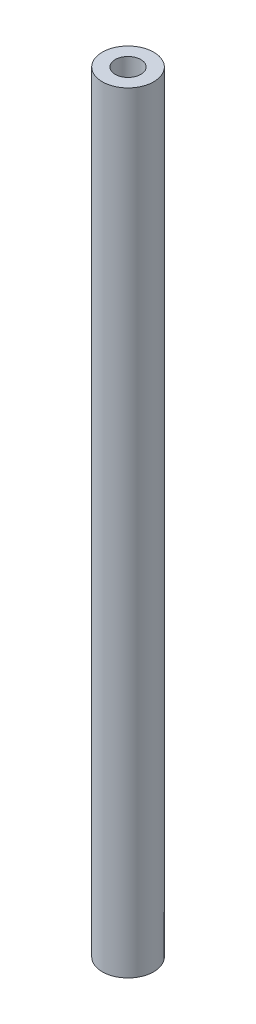
ISO-10303-21;
HEADER;
FILE_DESCRIPTION(('STEP AP214'),'2;1');
FILE_NAME('part.step','',(''),(''),'','','');
FILE_SCHEMA(('AUTOMOTIVE_DESIGN { 1 0 10303 214 1 1 1 1 }'));
ENDSEC;
DATA;
#1=APPLICATION_CONTEXT('core data for automotive mechanical design processes');
#2=APPLICATION_PROTOCOL_DEFINITION('international standard','automotive_design',2000,#1);
#3=PRODUCT_CONTEXT('',#1,'mechanical');
#4=PRODUCT('Part','Part','',(#3));
#5=PRODUCT_RELATED_PRODUCT_CATEGORY('part','',(#4));
#6=PRODUCT_DEFINITION_FORMATION('','',#4);
#7=PRODUCT_DEFINITION_CONTEXT('part definition',#1,'design');
#8=PRODUCT_DEFINITION('design','',#6,#7);
#9=PRODUCT_DEFINITION_SHAPE('','',#8);
#10=(LENGTH_UNIT() NAMED_UNIT(*) SI_UNIT(.MILLI.,.METRE.));
#11=(NAMED_UNIT(*) PLANE_ANGLE_UNIT() SI_UNIT($,.RADIAN.));
#12=(NAMED_UNIT(*) SI_UNIT($,.STERADIAN.) SOLID_ANGLE_UNIT());
#13=UNCERTAINTY_MEASURE_WITH_UNIT(LENGTH_MEASURE(1.E-05),#10,'distance_accuracy_value','');
#14=(GEOMETRIC_REPRESENTATION_CONTEXT(3) GLOBAL_UNCERTAINTY_ASSIGNED_CONTEXT((#13)) GLOBAL_UNIT_ASSIGNED_CONTEXT((#10,
#11,#12)) REPRESENTATION_CONTEXT('',''));
#15=CARTESIAN_POINT('',(0.,0.,0.));
#16=DIRECTION('',(0.,0.,1.));
#17=DIRECTION('',(1.,0.,0.));
#18=AXIS2_PLACEMENT_3D('',#15,#16,#17);
#19=CARTESIAN_POINT('',(0.,90.,0.));
#20=DIRECTION('',(0.,1.,0.));
#21=DIRECTION('',(0.,0.,1.));
#22=AXIS2_PLACEMENT_3D('',#19,#20,#21);
#23=PLANE('',#22);
#24=CARTESIAN_POINT('',(0.,90.,0.));
#25=DIRECTION('',(0.,1.,0.));
#26=DIRECTION('',(0.,0.,1.));
#27=AXIS2_PLACEMENT_3D('',#24,#25,#26);
#28=CIRCLE('',#27,3.);
#29=CARTESIAN_POINT('',(0.,90.,-3.));
#30=VERTEX_POINT('',#29);
#31=EDGE_CURVE('E10',#30,#30,#28,.T.);
#32=ORIENTED_EDGE('',*,*,#31,.T.);
#33=EDGE_LOOP('',(#32));
#34=FACE_BOUND('',#33,.T.);
#35=CARTESIAN_POINT('',(0.,90.,0.));
#36=DIRECTION('',(0.,1.,0.));
#37=DIRECTION('',(0.,0.,1.));
#38=AXIS2_PLACEMENT_3D('',#35,#36,#37);
#39=CIRCLE('',#38,1.5);
#40=CARTESIAN_POINT('',(0.,90.,-1.5));
#41=VERTEX_POINT('',#40);
#42=EDGE_CURVE('E50',#41,#41,#39,.T.);
#43=ORIENTED_EDGE('',*,*,#42,.F.);
#44=EDGE_LOOP('',(#43));
#45=FACE_BOUND('',#44,.T.);
#46=ADVANCED_FACE('F37',(#34,#45),#23,.T.);
#47=CARTESIAN_POINT('',(0.,0.,0.));
#48=DIRECTION('',(0.,1.,0.));
#49=DIRECTION('',(0.,0.,1.));
#50=AXIS2_PLACEMENT_3D('',#47,#48,#49);
#51=PLANE('',#50);
#52=CARTESIAN_POINT('',(0.,0.,0.));
#53=DIRECTION('',(0.,1.,0.));
#54=DIRECTION('',(0.,0.,1.));
#55=AXIS2_PLACEMENT_3D('',#52,#53,#54);
#56=CIRCLE('',#55,3.);
#57=CARTESIAN_POINT('',(0.,0.,-3.));
#58=VERTEX_POINT('',#57);
#59=EDGE_CURVE('E41',#58,#58,#56,.T.);
#60=ORIENTED_EDGE('',*,*,#59,.F.);
#61=EDGE_LOOP('',(#60));
#62=FACE_BOUND('',#61,.T.);
#63=CARTESIAN_POINT('',(0.,0.,0.));
#64=DIRECTION('',(0.,1.,0.));
#65=DIRECTION('',(0.,0.,1.));
#66=AXIS2_PLACEMENT_3D('',#63,#64,#65);
#67=CIRCLE('',#66,1.5);
#68=CARTESIAN_POINT('',(0.,0.,-1.5));
#69=VERTEX_POINT('',#68);
#70=EDGE_CURVE('E52',#69,#69,#67,.T.);
#71=ORIENTED_EDGE('',*,*,#70,.T.);
#72=EDGE_LOOP('',(#71));
#73=FACE_BOUND('',#72,.T.);
#74=ADVANCED_FACE('F64',(#62,#73),#51,.F.);
#75=CARTESIAN_POINT('',(0.,90.,0.));
#76=DIRECTION('',(0.,-1.,0.));
#77=DIRECTION('',(0.,0.,-1.));
#78=AXIS2_PLACEMENT_3D('',#75,#76,#77);
#79=CYLINDRICAL_SURFACE('',#78,3.);
#80=CARTESIAN_POINT('',(0.,90.,-3.));
#81=CARTESIAN_POINT('',(0.,89.0625,-3.));
#82=CARTESIAN_POINT('',(0.,88.125,-3.));
#83=CARTESIAN_POINT('',(0.,86.25,-3.));
#84=CARTESIAN_POINT('',(0.,85.3125,-3.));
#85=CARTESIAN_POINT('',(0.,83.4375,-3.));
#86=CARTESIAN_POINT('',(0.,82.5,-3.));
#87=CARTESIAN_POINT('',(0.,80.625,-3.));
#88=CARTESIAN_POINT('',(0.,79.6875,-3.));
#89=CARTESIAN_POINT('',(0.,77.8125,-3.));
#90=CARTESIAN_POINT('',(0.,76.875,-3.));
#91=CARTESIAN_POINT('',(0.,75.,-3.));
#92=CARTESIAN_POINT('',(0.,74.0625,-3.));
#93=CARTESIAN_POINT('',(0.,72.1875,-3.));
#94=CARTESIAN_POINT('',(0.,71.25,-3.));
#95=CARTESIAN_POINT('',(0.,69.375,-3.));
#96=CARTESIAN_POINT('',(0.,68.4375,-3.));
#97=CARTESIAN_POINT('',(0.,66.5625,-3.));
#98=CARTESIAN_POINT('',(0.,65.625,-3.));
#99=CARTESIAN_POINT('',(0.,63.75,-3.));
#100=CARTESIAN_POINT('',(0.,62.8125,-3.));
#101=CARTESIAN_POINT('',(0.,60.9375,-3.));
#102=CARTESIAN_POINT('',(0.,60.,-3.));
#103=CARTESIAN_POINT('',(0.,58.125,-3.));
#104=CARTESIAN_POINT('',(0.,57.1875,-3.));
#105=CARTESIAN_POINT('',(0.,55.3125,-3.));
#106=CARTESIAN_POINT('',(0.,54.375,-3.));
#107=CARTESIAN_POINT('',(0.,52.5,-3.));
#108=CARTESIAN_POINT('',(0.,51.5625,-3.));
#109=CARTESIAN_POINT('',(0.,49.6875,-3.));
#110=CARTESIAN_POINT('',(0.,48.75,-3.));
#111=CARTESIAN_POINT('',(0.,46.875,-3.));
#112=CARTESIAN_POINT('',(0.,45.9375,-3.));
#113=CARTESIAN_POINT('',(0.,44.0625,-3.));
#114=CARTESIAN_POINT('',(0.,43.125,-3.));
#115=CARTESIAN_POINT('',(0.,41.25,-3.));
#116=CARTESIAN_POINT('',(0.,40.3125,-3.));
#117=CARTESIAN_POINT('',(0.,38.4375,-3.));
#118=CARTESIAN_POINT('',(0.,37.5,-3.));
#119=CARTESIAN_POINT('',(0.,35.625,-3.));
#120=CARTESIAN_POINT('',(0.,34.6875,-3.));
#121=CARTESIAN_POINT('',(0.,32.8125,-3.));
#122=CARTESIAN_POINT('',(0.,31.875,-3.));
#123=CARTESIAN_POINT('',(0.,30.,-3.));
#124=CARTESIAN_POINT('',(0.,29.0625,-3.));
#125=CARTESIAN_POINT('',(0.,27.1875,-3.));
#126=CARTESIAN_POINT('',(0.,26.25,-3.));
#127=CARTESIAN_POINT('',(0.,24.375,-3.));
#128=CARTESIAN_POINT('',(0.,23.4375,-3.));
#129=CARTESIAN_POINT('',(0.,21.5625,-3.));
#130=CARTESIAN_POINT('',(0.,20.625,-3.));
#131=CARTESIAN_POINT('',(0.,18.75,-3.));
#132=CARTESIAN_POINT('',(0.,17.8125,-3.));
#133=CARTESIAN_POINT('',(0.,15.9375,-3.));
#134=CARTESIAN_POINT('',(0.,15.,-3.));
#135=CARTESIAN_POINT('',(0.,13.125,-3.));
#136=CARTESIAN_POINT('',(0.,12.1875,-3.));
#137=CARTESIAN_POINT('',(0.,10.3125,-3.));
#138=CARTESIAN_POINT('',(0.,9.37499999999999,-3.));
#139=CARTESIAN_POINT('',(0.,7.49999999999999,-3.));
#140=CARTESIAN_POINT('',(0.,6.56249999999999,-3.));
#141=CARTESIAN_POINT('',(0.,4.68749999999999,-3.));
#142=CARTESIAN_POINT('',(0.,3.74999999999998,-3.));
#143=CARTESIAN_POINT('',(0.,1.87499999999998,-3.));
#144=CARTESIAN_POINT('',(0.,0.937499999999986,-3.));
#145=CARTESIAN_POINT('',(0.,0.,-3.));
#146=B_SPLINE_CURVE_WITH_KNOTS('',3,(#80,#81,#82,#83,#84,#85,#86,#87,#88,#89,#90,#91,#92,#93,
#94,#95,#96,#97,#98,#99,#100,#101,#102,#103,#104,#105,#106,#107,#108,#109,#110,#111,#112,#113,
#114,#115,#116,#117,#118,#119,#120,#121,#122,#123,#124,#125,#126,#127,#128,#129,#130,#131,#132,
#133,#134,#135,#136,#137,#138,#139,#140,#141,#142,#143,#144,#145),.UNSPECIFIED.,.F.,.F.,(4,2,2,
2,2,2,2,2,2,2,2,2,2,2,2,2,2,2,2,2,2,2,2,2,2,2,2,2,2,2,2,2,4),(0.,2.8125,5.62499999999999,
8.43749999999999,11.25,14.0625,16.875,19.6875,22.5,25.3125,28.125,30.9375,33.75,36.5625,39.375,
42.1875,45.,47.8125,50.625,53.4375,56.25,59.0625,61.875,64.6875,67.5,70.3125,73.125,75.9375,
78.75,81.5625,84.375,87.1875,90.),.UNSPECIFIED.);
#147=EDGE_CURVE('BSEAM39',#30,#58,#146,.T.);
#148=ORIENTED_EDGE('',*,*,#31,.F.);
#149=ORIENTED_EDGE('',*,*,#59,.T.);
#150=ORIENTED_EDGE('',*,*,#147,.T.);
#151=ORIENTED_EDGE('',*,*,#147,.F.);
#152=EDGE_LOOP('',(#148,#150,#149,#151));
#153=FACE_BOUND('',#152,.T.);
#154=ADVANCED_FACE('F39',(#153),#79,.T.);
#155=CARTESIAN_POINT('',(0.,90.,0.));
#156=DIRECTION('',(0.,-1.,0.));
#157=DIRECTION('',(0.,0.,-1.));
#158=AXIS2_PLACEMENT_3D('',#155,#156,#157);
#159=CYLINDRICAL_SURFACE('',#158,1.5);
#160=CARTESIAN_POINT('',(0.,90.,-1.5));
#161=CARTESIAN_POINT('',(0.,89.0625,-1.5));
#162=CARTESIAN_POINT('',(0.,88.125,-1.5));
#163=CARTESIAN_POINT('',(0.,86.25,-1.5));
#164=CARTESIAN_POINT('',(0.,85.3125,-1.5));
#165=CARTESIAN_POINT('',(0.,83.4375,-1.5));
#166=CARTESIAN_POINT('',(0.,82.5,-1.5));
#167=CARTESIAN_POINT('',(0.,80.625,-1.5));
#168=CARTESIAN_POINT('',(0.,79.6875,-1.5));
#169=CARTESIAN_POINT('',(0.,77.8125,-1.5));
#170=CARTESIAN_POINT('',(0.,76.875,-1.5));
#171=CARTESIAN_POINT('',(0.,75.,-1.5));
#172=CARTESIAN_POINT('',(0.,74.0625,-1.5));
#173=CARTESIAN_POINT('',(0.,72.1875,-1.5));
#174=CARTESIAN_POINT('',(0.,71.25,-1.5));
#175=CARTESIAN_POINT('',(0.,69.375,-1.5));
#176=CARTESIAN_POINT('',(0.,68.4375,-1.5));
#177=CARTESIAN_POINT('',(0.,66.5625,-1.5));
#178=CARTESIAN_POINT('',(0.,65.625,-1.5));
#179=CARTESIAN_POINT('',(0.,63.75,-1.5));
#180=CARTESIAN_POINT('',(0.,62.8125,-1.5));
#181=CARTESIAN_POINT('',(0.,60.9375,-1.5));
#182=CARTESIAN_POINT('',(0.,60.,-1.5));
#183=CARTESIAN_POINT('',(0.,58.125,-1.5));
#184=CARTESIAN_POINT('',(0.,57.1875,-1.5));
#185=CARTESIAN_POINT('',(0.,55.3125,-1.5));
#186=CARTESIAN_POINT('',(0.,54.375,-1.5));
#187=CARTESIAN_POINT('',(0.,52.5,-1.5));
#188=CARTESIAN_POINT('',(0.,51.5625,-1.5));
#189=CARTESIAN_POINT('',(0.,49.6875,-1.5));
#190=CARTESIAN_POINT('',(0.,48.75,-1.5));
#191=CARTESIAN_POINT('',(0.,46.875,-1.5));
#192=CARTESIAN_POINT('',(0.,45.9375,-1.5));
#193=CARTESIAN_POINT('',(0.,44.0625,-1.5));
#194=CARTESIAN_POINT('',(0.,43.125,-1.5));
#195=CARTESIAN_POINT('',(0.,41.25,-1.5));
#196=CARTESIAN_POINT('',(0.,40.3125,-1.5));
#197=CARTESIAN_POINT('',(0.,38.4375,-1.5));
#198=CARTESIAN_POINT('',(0.,37.5,-1.5));
#199=CARTESIAN_POINT('',(0.,35.625,-1.5));
#200=CARTESIAN_POINT('',(0.,34.6875,-1.5));
#201=CARTESIAN_POINT('',(0.,32.8125,-1.5));
#202=CARTESIAN_POINT('',(0.,31.875,-1.5));
#203=CARTESIAN_POINT('',(0.,30.,-1.5));
#204=CARTESIAN_POINT('',(0.,29.0625,-1.5));
#205=CARTESIAN_POINT('',(0.,27.1875,-1.5));
#206=CARTESIAN_POINT('',(0.,26.25,-1.5));
#207=CARTESIAN_POINT('',(0.,24.375,-1.5));
#208=CARTESIAN_POINT('',(0.,23.4375,-1.5));
#209=CARTESIAN_POINT('',(0.,21.5625,-1.5));
#210=CARTESIAN_POINT('',(0.,20.625,-1.5));
#211=CARTESIAN_POINT('',(0.,18.75,-1.5));
#212=CARTESIAN_POINT('',(0.,17.8125,-1.5));
#213=CARTESIAN_POINT('',(0.,15.9375,-1.5));
#214=CARTESIAN_POINT('',(0.,15.,-1.5));
#215=CARTESIAN_POINT('',(0.,13.125,-1.5));
#216=CARTESIAN_POINT('',(0.,12.1875,-1.5));
#217=CARTESIAN_POINT('',(0.,10.3125,-1.5));
#218=CARTESIAN_POINT('',(0.,9.37499999999999,-1.5));
#219=CARTESIAN_POINT('',(0.,7.49999999999999,-1.5));
#220=CARTESIAN_POINT('',(0.,6.56249999999999,-1.5));
#221=CARTESIAN_POINT('',(0.,4.68749999999999,-1.5));
#222=CARTESIAN_POINT('',(0.,3.74999999999998,-1.5));
#223=CARTESIAN_POINT('',(0.,1.87499999999998,-1.5));
#224=CARTESIAN_POINT('',(0.,0.937499999999986,-1.5));
#225=CARTESIAN_POINT('',(0.,0.,-1.5));
#226=B_SPLINE_CURVE_WITH_KNOTS('',3,(#160,#161,#162,#163,#164,#165,#166,#167,#168,#169,#170,
#171,#172,#173,#174,#175,#176,#177,#178,#179,#180,#181,#182,#183,#184,#185,#186,#187,#188,#189,
#190,#191,#192,#193,#194,#195,#196,#197,#198,#199,#200,#201,#202,#203,#204,#205,#206,#207,#208,
#209,#210,#211,#212,#213,#214,#215,#216,#217,#218,#219,#220,#221,#222,#223,#224,#225),
.UNSPECIFIED.,.F.,.F.,(4,2,2,2,2,2,2,2,2,2,2,2,2,2,2,2,2,2,2,2,2,2,2,2,2,2,2,2,2,2,2,2,4),(0.,
2.81250000000001,5.62500000000001,8.43750000000001,11.25,14.0625,16.875,19.6875,22.5,25.3125,
28.125,30.9375,33.75,36.5625,39.375,42.1875,45.,47.8125,50.625,53.4375,56.25,59.0625,61.875,
64.6875,67.5,70.3125,73.125,75.9375,78.75,81.5625,84.375,87.1875,90.),.UNSPECIFIED.);
#227=EDGE_CURVE('BSEAM60',#41,#69,#226,.T.);
#228=ORIENTED_EDGE('',*,*,#42,.T.);
#229=ORIENTED_EDGE('',*,*,#70,.F.);
#230=ORIENTED_EDGE('',*,*,#227,.T.);
#231=ORIENTED_EDGE('',*,*,#227,.F.);
#232=EDGE_LOOP('',(#228,#230,#229,#231));
#233=FACE_BOUND('',#232,.T.);
#234=ADVANCED_FACE('F60',(#233),#159,.F.);
#235=CLOSED_SHELL('',(#46,#74,#154,#234));
#236=MANIFOLD_SOLID_BREP('B2',#235);
#237=ADVANCED_BREP_SHAPE_REPRESENTATION('',(#18,#236),#14);
#238=SHAPE_DEFINITION_REPRESENTATION(#9,#237);
ENDSEC;
END-ISO-10303-21;
